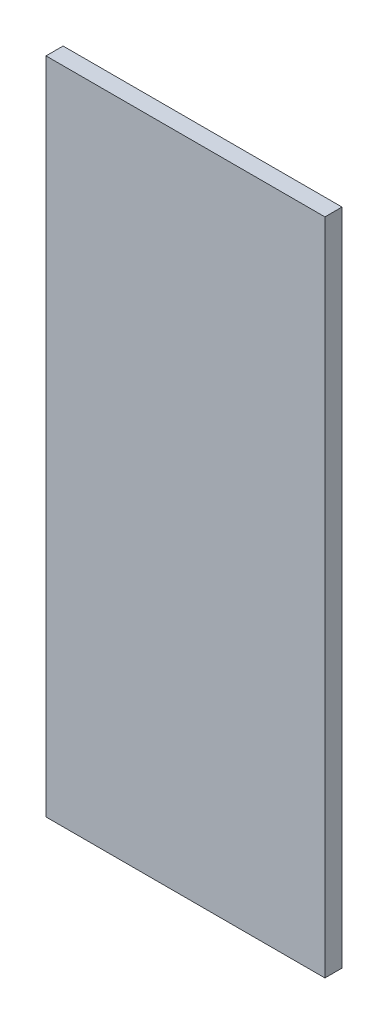
ISO-10303-21;
HEADER;
FILE_DESCRIPTION(('STEP AP214'),'2;1');
FILE_NAME('part.step','',(''),(''),'','','');
FILE_SCHEMA(('AUTOMOTIVE_DESIGN { 1 0 10303 214 1 1 1 1 }'));
ENDSEC;
DATA;
#1=APPLICATION_CONTEXT('core data for automotive mechanical design processes');
#2=APPLICATION_PROTOCOL_DEFINITION('international standard','automotive_design',2000,#1);
#3=PRODUCT_CONTEXT('',#1,'mechanical');
#4=PRODUCT('Part','Part','',(#3));
#5=PRODUCT_RELATED_PRODUCT_CATEGORY('part','',(#4));
#6=PRODUCT_DEFINITION_FORMATION('','',#4);
#7=PRODUCT_DEFINITION_CONTEXT('part definition',#1,'design');
#8=PRODUCT_DEFINITION('design','',#6,#7);
#9=PRODUCT_DEFINITION_SHAPE('','',#8);
#10=(LENGTH_UNIT() NAMED_UNIT(*) SI_UNIT(.MILLI.,.METRE.));
#11=(NAMED_UNIT(*) PLANE_ANGLE_UNIT() SI_UNIT($,.RADIAN.));
#12=(NAMED_UNIT(*) SI_UNIT($,.STERADIAN.) SOLID_ANGLE_UNIT());
#13=UNCERTAINTY_MEASURE_WITH_UNIT(LENGTH_MEASURE(1.E-05),#10,'distance_accuracy_value','');
#14=(GEOMETRIC_REPRESENTATION_CONTEXT(3) GLOBAL_UNCERTAINTY_ASSIGNED_CONTEXT((#13)) GLOBAL_UNIT_ASSIGNED_CONTEXT((#10,
#11,#12)) REPRESENTATION_CONTEXT('',''));
#15=CARTESIAN_POINT('',(0.,0.,0.));
#16=DIRECTION('',(0.,0.,1.));
#17=DIRECTION('',(1.,0.,0.));
#18=AXIS2_PLACEMENT_3D('',#15,#16,#17);
#19=CARTESIAN_POINT('',(0.,0.,15.));
#20=DIRECTION('',(1.,0.,0.));
#21=DIRECTION('',(0.,0.,-1.));
#22=AXIS2_PLACEMENT_3D('',#19,#20,#21);
#23=PLANE('',#22);
#24=DIRECTION('',(0.,-1.,0.));
#25=VECTOR('',#24,1.);
#26=CARTESIAN_POINT('',(0.,0.,0.));
#27=LINE('',#26,#25);
#28=CARTESIAN_POINT('',(0.,579.,0.));
#29=VERTEX_POINT('',#28);
#30=CARTESIAN_POINT('',(0.,0.,0.));
#31=VERTEX_POINT('',#30);
#32=EDGE_CURVE('E96',#29,#31,#27,.T.);
#33=ORIENTED_EDGE('',*,*,#32,.T.);
#34=DIRECTION('',(0.,0.,-1.));
#35=VECTOR('',#34,1.);
#36=CARTESIAN_POINT('',(0.,0.,15.));
#37=LINE('',#36,#35);
#38=CARTESIAN_POINT('',(0.,0.,15.));
#39=VERTEX_POINT('',#38);
#40=EDGE_CURVE('E11',#39,#31,#37,.T.);
#41=ORIENTED_EDGE('',*,*,#40,.F.);
#42=DIRECTION('',(0.,-1.,0.));
#43=VECTOR('',#42,1.);
#44=CARTESIAN_POINT('',(0.,0.,15.));
#45=LINE('',#44,#43);
#46=CARTESIAN_POINT('',(0.,579.,15.));
#47=VERTEX_POINT('',#46);
#48=EDGE_CURVE('E84',#47,#39,#45,.T.);
#49=ORIENTED_EDGE('',*,*,#48,.F.);
#50=DIRECTION('',(0.,0.,-1.));
#51=VECTOR('',#50,1.);
#52=CARTESIAN_POINT('',(0.,579.,15.));
#53=LINE('',#52,#51);
#54=EDGE_CURVE('E92',#47,#29,#53,.T.);
#55=ORIENTED_EDGE('',*,*,#54,.T.);
#56=EDGE_LOOP('',(#33,#41,#49,#55));
#57=FACE_BOUND('',#56,.T.);
#58=ADVANCED_FACE('F33',(#57),#23,.F.);
#59=CARTESIAN_POINT('',(0.,0.,15.));
#60=DIRECTION('',(0.,1.,0.));
#61=DIRECTION('',(0.,0.,1.));
#62=AXIS2_PLACEMENT_3D('',#59,#60,#61);
#63=PLANE('',#62);
#64=DIRECTION('',(1.,0.,0.));
#65=VECTOR('',#64,1.);
#66=CARTESIAN_POINT('',(0.,0.,0.));
#67=LINE('',#66,#65);
#68=CARTESIAN_POINT('',(245.,0.,0.));
#69=VERTEX_POINT('',#68);
#70=EDGE_CURVE('E88',#31,#69,#67,.T.);
#71=ORIENTED_EDGE('',*,*,#70,.T.);
#72=DIRECTION('',(0.,0.,-1.));
#73=VECTOR('',#72,1.);
#74=CARTESIAN_POINT('',(245.,0.,15.));
#75=LINE('',#74,#73);
#76=CARTESIAN_POINT('',(245.,0.,15.));
#77=VERTEX_POINT('',#76);
#78=EDGE_CURVE('E41',#77,#69,#75,.T.);
#79=ORIENTED_EDGE('',*,*,#78,.F.);
#80=DIRECTION('',(1.,0.,0.));
#81=VECTOR('',#80,1.);
#82=CARTESIAN_POINT('',(0.,0.,15.));
#83=LINE('',#82,#81);
#84=EDGE_CURVE('E79',#39,#77,#83,.T.);
#85=ORIENTED_EDGE('',*,*,#84,.F.);
#86=ORIENTED_EDGE('',*,*,#40,.T.);
#87=EDGE_LOOP('',(#71,#79,#85,#86));
#88=FACE_BOUND('',#87,.T.);
#89=ADVANCED_FACE('F87',(#88),#63,.F.);
#90=CARTESIAN_POINT('',(245.,0.,15.));
#91=DIRECTION('',(-1.,0.,0.));
#92=DIRECTION('',(0.,0.,1.));
#93=AXIS2_PLACEMENT_3D('',#90,#91,#92);
#94=PLANE('',#93);
#95=DIRECTION('',(0.,1.,0.));
#96=VECTOR('',#95,1.);
#97=CARTESIAN_POINT('',(245.,0.,0.));
#98=LINE('',#97,#96);
#99=CARTESIAN_POINT('',(245.,579.,0.));
#100=VERTEX_POINT('',#99);
#101=EDGE_CURVE('E66',#69,#100,#98,.T.);
#102=ORIENTED_EDGE('',*,*,#101,.T.);
#103=DIRECTION('',(0.,0.,-1.));
#104=VECTOR('',#103,1.);
#105=CARTESIAN_POINT('',(245.,579.,15.));
#106=LINE('',#105,#104);
#107=CARTESIAN_POINT('',(245.,579.,15.));
#108=VERTEX_POINT('',#107);
#109=EDGE_CURVE('E89',#108,#100,#106,.T.);
#110=ORIENTED_EDGE('',*,*,#109,.F.);
#111=DIRECTION('',(0.,1.,0.));
#112=VECTOR('',#111,1.);
#113=CARTESIAN_POINT('',(245.,0.,15.));
#114=LINE('',#113,#112);
#115=EDGE_CURVE('E82',#77,#108,#114,.T.);
#116=ORIENTED_EDGE('',*,*,#115,.F.);
#117=ORIENTED_EDGE('',*,*,#78,.T.);
#118=EDGE_LOOP('',(#102,#110,#116,#117));
#119=FACE_BOUND('',#118,.T.);
#120=ADVANCED_FACE('F90',(#119),#94,.F.);
#121=CARTESIAN_POINT('',(0.,579.,15.));
#122=DIRECTION('',(0.,-1.,0.));
#123=DIRECTION('',(0.,0.,-1.));
#124=AXIS2_PLACEMENT_3D('',#121,#122,#123);
#125=PLANE('',#124);
#126=DIRECTION('',(-1.,0.,0.));
#127=VECTOR('',#126,1.);
#128=CARTESIAN_POINT('',(0.,579.,0.));
#129=LINE('',#128,#127);
#130=EDGE_CURVE('E72',#100,#29,#129,.T.);
#131=ORIENTED_EDGE('',*,*,#130,.T.);
#132=ORIENTED_EDGE('',*,*,#54,.F.);
#133=DIRECTION('',(-1.,0.,0.));
#134=VECTOR('',#133,1.);
#135=CARTESIAN_POINT('',(0.,579.,15.));
#136=LINE('',#135,#134);
#137=EDGE_CURVE('E49',#108,#47,#136,.T.);
#138=ORIENTED_EDGE('',*,*,#137,.F.);
#139=ORIENTED_EDGE('',*,*,#109,.T.);
#140=EDGE_LOOP('',(#131,#132,#138,#139));
#141=FACE_BOUND('',#140,.T.);
#142=ADVANCED_FACE('F103',(#141),#125,.F.);
#143=CARTESIAN_POINT('',(0.,0.,15.));
#144=DIRECTION('',(0.,0.,-1.));
#145=DIRECTION('',(-1.,0.,0.));
#146=AXIS2_PLACEMENT_3D('',#143,#144,#145);
#147=PLANE('',#146);
#148=ORIENTED_EDGE('',*,*,#48,.T.);
#149=ORIENTED_EDGE('',*,*,#84,.T.);
#150=ORIENTED_EDGE('',*,*,#115,.T.);
#151=ORIENTED_EDGE('',*,*,#137,.T.);
#152=EDGE_LOOP('',(#148,#149,#150,#151));
#153=FACE_BOUND('',#152,.T.);
#154=ADVANCED_FACE('F80',(#153),#147,.F.);
#155=CARTESIAN_POINT('',(0.,0.,0.));
#156=DIRECTION('',(0.,0.,-1.));
#157=DIRECTION('',(-1.,0.,0.));
#158=AXIS2_PLACEMENT_3D('',#155,#156,#157);
#159=PLANE('',#158);
#160=ORIENTED_EDGE('',*,*,#32,.F.);
#161=ORIENTED_EDGE('',*,*,#130,.F.);
#162=ORIENTED_EDGE('',*,*,#101,.F.);
#163=ORIENTED_EDGE('',*,*,#70,.F.);
#164=EDGE_LOOP('',(#160,#161,#162,#163));
#165=FACE_BOUND('',#164,.T.);
#166=ADVANCED_FACE('F106',(#165),#159,.T.);
#167=CLOSED_SHELL('',(#58,#89,#120,#142,#154,#166));
#168=MANIFOLD_SOLID_BREP('B2',#167);
#169=ADVANCED_BREP_SHAPE_REPRESENTATION('',(#18,#168),#14);
#170=SHAPE_DEFINITION_REPRESENTATION(#9,#169);
ENDSEC;
END-ISO-10303-21;
